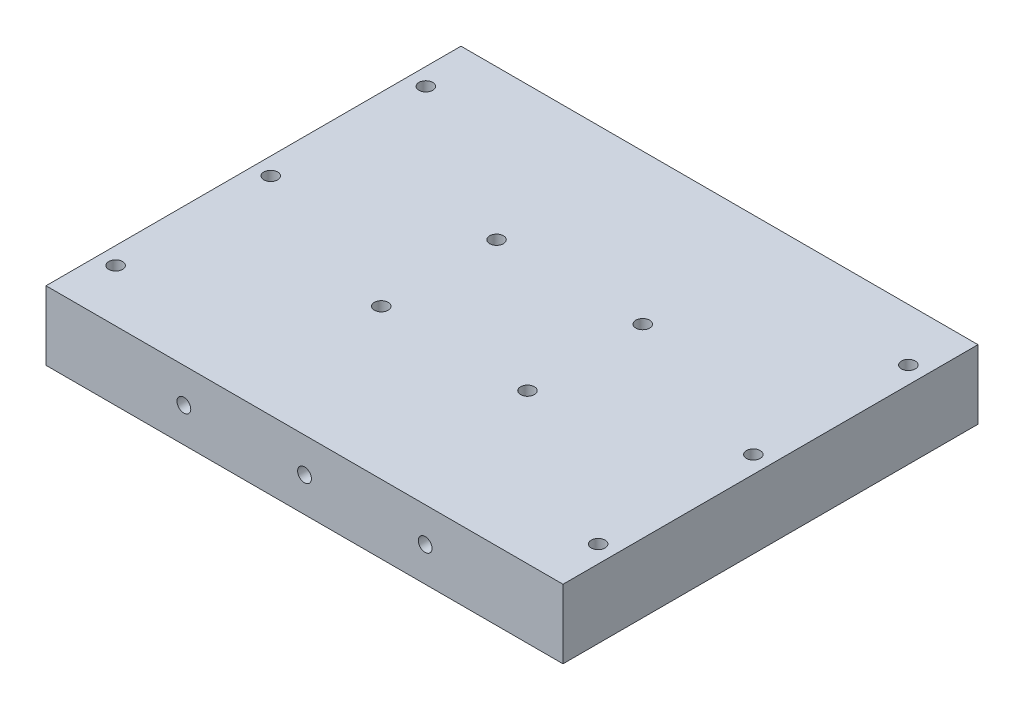
ISO-10303-21;
HEADER;
FILE_DESCRIPTION(('STEP AP214'),'2;1');
FILE_NAME('part.step','',(''),(''),'','','');
FILE_SCHEMA(('AUTOMOTIVE_DESIGN { 1 0 10303 214 1 1 1 1 }'));
ENDSEC;
DATA;
#1=APPLICATION_CONTEXT('core data for automotive mechanical design processes');
#2=APPLICATION_PROTOCOL_DEFINITION('international standard','automotive_design',2000,#1);
#3=PRODUCT_CONTEXT('',#1,'mechanical');
#4=PRODUCT('Part','Part','',(#3));
#5=PRODUCT_RELATED_PRODUCT_CATEGORY('part','',(#4));
#6=PRODUCT_DEFINITION_FORMATION('','',#4);
#7=PRODUCT_DEFINITION_CONTEXT('part definition',#1,'design');
#8=PRODUCT_DEFINITION('design','',#6,#7);
#9=PRODUCT_DEFINITION_SHAPE('','',#8);
#10=(LENGTH_UNIT() NAMED_UNIT(*) SI_UNIT(.MILLI.,.METRE.));
#11=(NAMED_UNIT(*) PLANE_ANGLE_UNIT() SI_UNIT($,.RADIAN.));
#12=(NAMED_UNIT(*) SI_UNIT($,.STERADIAN.) SOLID_ANGLE_UNIT());
#13=UNCERTAINTY_MEASURE_WITH_UNIT(LENGTH_MEASURE(1.E-05),#10,'distance_accuracy_value','');
#14=(GEOMETRIC_REPRESENTATION_CONTEXT(3) GLOBAL_UNCERTAINTY_ASSIGNED_CONTEXT((#13)) GLOBAL_UNIT_ASSIGNED_CONTEXT((#10,
#11,#12)) REPRESENTATION_CONTEXT('',''));
#15=CARTESIAN_POINT('',(0.,0.,0.));
#16=DIRECTION('',(0.,0.,1.));
#17=DIRECTION('',(1.,0.,0.));
#18=AXIS2_PLACEMENT_3D('',#15,#16,#17);
#19=CARTESIAN_POINT('',(0.,20.,0.));
#20=DIRECTION('',(1.,0.,0.));
#21=DIRECTION('',(0.,0.,-1.));
#22=AXIS2_PLACEMENT_3D('',#19,#20,#21);
#23=PLANE('',#22);
#24=DIRECTION('',(0.,0.,1.));
#25=VECTOR('',#24,1.);
#26=CARTESIAN_POINT('',(0.,0.,0.));
#27=LINE('',#26,#25);
#28=CARTESIAN_POINT('',(0.,0.,-120.4));
#29=VERTEX_POINT('',#28);
#30=CARTESIAN_POINT('',(0.,0.,0.));
#31=VERTEX_POINT('',#30);
#32=EDGE_CURVE('E96',#29,#31,#27,.T.);
#33=ORIENTED_EDGE('',*,*,#32,.T.);
#34=DIRECTION('',(0.,-1.,0.));
#35=VECTOR('',#34,1.);
#36=CARTESIAN_POINT('',(0.,20.,0.));
#37=LINE('',#36,#35);
#38=CARTESIAN_POINT('',(0.,20.,0.));
#39=VERTEX_POINT('',#38);
#40=EDGE_CURVE('E11',#39,#31,#37,.T.);
#41=ORIENTED_EDGE('',*,*,#40,.F.);
#42=DIRECTION('',(0.,0.,1.));
#43=VECTOR('',#42,1.);
#44=CARTESIAN_POINT('',(0.,20.,0.));
#45=LINE('',#44,#43);
#46=CARTESIAN_POINT('',(0.,20.,-120.4));
#47=VERTEX_POINT('',#46);
#48=EDGE_CURVE('E84',#47,#39,#45,.T.);
#49=ORIENTED_EDGE('',*,*,#48,.F.);
#50=DIRECTION('',(0.,-1.,0.));
#51=VECTOR('',#50,1.);
#52=CARTESIAN_POINT('',(0.,20.,-120.4));
#53=LINE('',#52,#51);
#54=EDGE_CURVE('E92',#47,#29,#53,.T.);
#55=ORIENTED_EDGE('',*,*,#54,.T.);
#56=EDGE_LOOP('',(#33,#41,#49,#55));
#57=FACE_BOUND('',#56,.T.);
#58=ADVANCED_FACE('F33',(#57),#23,.F.);
#59=CARTESIAN_POINT('',(0.,20.,0.));
#60=DIRECTION('',(0.,0.,-1.));
#61=DIRECTION('',(-1.,0.,0.));
#62=AXIS2_PLACEMENT_3D('',#59,#60,#61);
#63=PLANE('',#62);
#64=CARTESIAN_POINT('',(110.,10.,0.));
#65=DIRECTION('',(0.,0.,1.));
#66=DIRECTION('',(1.,0.,0.));
#67=AXIS2_PLACEMENT_3D('',#64,#65,#66);
#68=CIRCLE('',#67,2.);
#69=CARTESIAN_POINT('',(112.,10.,0.));
#70=VERTEX_POINT('',#69);
#71=EDGE_CURVE('E134',#70,#70,#68,.T.);
#72=ORIENTED_EDGE('',*,*,#71,.F.);
#73=EDGE_LOOP('',(#72));
#74=FACE_BOUND('',#73,.T.);
#75=CARTESIAN_POINT('',(40.,10.,0.));
#76=DIRECTION('',(0.,0.,1.));
#77=DIRECTION('',(1.,0.,0.));
#78=AXIS2_PLACEMENT_3D('',#75,#76,#77);
#79=CIRCLE('',#78,2.);
#80=CARTESIAN_POINT('',(42.,10.,0.));
#81=VERTEX_POINT('',#80);
#82=EDGE_CURVE('E141',#81,#81,#79,.T.);
#83=ORIENTED_EDGE('',*,*,#82,.F.);
#84=EDGE_LOOP('',(#83));
#85=FACE_BOUND('',#84,.T.);
#86=CARTESIAN_POINT('',(75.,10.,0.));
#87=DIRECTION('',(0.,0.,1.));
#88=DIRECTION('',(1.,0.,0.));
#89=AXIS2_PLACEMENT_3D('',#86,#87,#88);
#90=CIRCLE('',#89,2.);
#91=CARTESIAN_POINT('',(77.,10.,0.));
#92=VERTEX_POINT('',#91);
#93=EDGE_CURVE('E128',#92,#92,#90,.T.);
#94=ORIENTED_EDGE('',*,*,#93,.F.);
#95=EDGE_LOOP('',(#94));
#96=FACE_BOUND('',#95,.T.);
#97=DIRECTION('',(1.,0.,0.));
#98=VECTOR('',#97,1.);
#99=CARTESIAN_POINT('',(0.,0.,0.));
#100=LINE('',#99,#98);
#101=CARTESIAN_POINT('',(150.,0.,0.));
#102=VERTEX_POINT('',#101);
#103=EDGE_CURVE('E88',#31,#102,#100,.T.);
#104=ORIENTED_EDGE('',*,*,#103,.T.);
#105=DIRECTION('',(0.,-1.,0.));
#106=VECTOR('',#105,1.);
#107=CARTESIAN_POINT('',(150.,20.,0.));
#108=LINE('',#107,#106);
#109=CARTESIAN_POINT('',(150.,20.,0.));
#110=VERTEX_POINT('',#109);
#111=EDGE_CURVE('E41',#110,#102,#108,.T.);
#112=ORIENTED_EDGE('',*,*,#111,.F.);
#113=DIRECTION('',(1.,0.,0.));
#114=VECTOR('',#113,1.);
#115=CARTESIAN_POINT('',(0.,20.,0.));
#116=LINE('',#115,#114);
#117=EDGE_CURVE('E79',#39,#110,#116,.T.);
#118=ORIENTED_EDGE('',*,*,#117,.F.);
#119=ORIENTED_EDGE('',*,*,#40,.T.);
#120=EDGE_LOOP('',(#104,#112,#118,#119));
#121=FACE_BOUND('',#120,.T.);
#122=ADVANCED_FACE('F87',(#74,#85,#96,#121),#63,.F.);
#123=CARTESIAN_POINT('',(150.,20.,0.));
#124=DIRECTION('',(-1.,0.,0.));
#125=DIRECTION('',(0.,0.,1.));
#126=AXIS2_PLACEMENT_3D('',#123,#124,#125);
#127=PLANE('',#126);
#128=DIRECTION('',(0.,0.,-1.));
#129=VECTOR('',#128,1.);
#130=CARTESIAN_POINT('',(150.,0.,0.));
#131=LINE('',#130,#129);
#132=CARTESIAN_POINT('',(150.,0.,-120.4));
#133=VERTEX_POINT('',#132);
#134=EDGE_CURVE('E66',#102,#133,#131,.T.);
#135=ORIENTED_EDGE('',*,*,#134,.T.);
#136=DIRECTION('',(0.,-1.,0.));
#137=VECTOR('',#136,1.);
#138=CARTESIAN_POINT('',(150.,20.,-120.4));
#139=LINE('',#138,#137);
#140=CARTESIAN_POINT('',(150.,20.,-120.4));
#141=VERTEX_POINT('',#140);
#142=EDGE_CURVE('E89',#141,#133,#139,.T.);
#143=ORIENTED_EDGE('',*,*,#142,.F.);
#144=DIRECTION('',(0.,0.,-1.));
#145=VECTOR('',#144,1.);
#146=CARTESIAN_POINT('',(150.,20.,0.));
#147=LINE('',#146,#145);
#148=EDGE_CURVE('E82',#110,#141,#147,.T.);
#149=ORIENTED_EDGE('',*,*,#148,.F.);
#150=ORIENTED_EDGE('',*,*,#111,.T.);
#151=EDGE_LOOP('',(#135,#143,#149,#150));
#152=FACE_BOUND('',#151,.T.);
#153=ADVANCED_FACE('F90',(#152),#127,.F.);
#154=CARTESIAN_POINT('',(0.,20.,-120.4));
#155=DIRECTION('',(0.,0.,1.));
#156=DIRECTION('',(1.,0.,0.));
#157=AXIS2_PLACEMENT_3D('',#154,#155,#156);
#158=PLANE('',#157);
#159=CARTESIAN_POINT('',(40.,10.,-120.4));
#160=DIRECTION('',(0.,0.,-1.));
#161=DIRECTION('',(-1.,0.,0.));
#162=AXIS2_PLACEMENT_3D('',#159,#160,#161);
#163=CIRCLE('',#162,2.);
#164=CARTESIAN_POINT('',(38.,10.,-120.4));
#165=VERTEX_POINT('',#164);
#166=EDGE_CURVE('E123',#165,#165,#163,.T.);
#167=ORIENTED_EDGE('',*,*,#166,.F.);
#168=EDGE_LOOP('',(#167));
#169=FACE_BOUND('',#168,.T.);
#170=CARTESIAN_POINT('',(75.,10.,-120.4));
#171=DIRECTION('',(0.,0.,-1.));
#172=DIRECTION('',(-1.,0.,0.));
#173=AXIS2_PLACEMENT_3D('',#170,#171,#172);
#174=CIRCLE('',#173,2.00000000000001);
#175=CARTESIAN_POINT('',(73.,10.,-120.4));
#176=VERTEX_POINT('',#175);
#177=EDGE_CURVE('E117',#176,#176,#174,.T.);
#178=ORIENTED_EDGE('',*,*,#177,.F.);
#179=EDGE_LOOP('',(#178));
#180=FACE_BOUND('',#179,.T.);
#181=CARTESIAN_POINT('',(110.,10.,-120.4));
#182=DIRECTION('',(0.,0.,-1.));
#183=DIRECTION('',(-1.,0.,0.));
#184=AXIS2_PLACEMENT_3D('',#181,#182,#183);
#185=CIRCLE('',#184,2.00000000000001);
#186=CARTESIAN_POINT('',(108.,10.,-120.4));
#187=VERTEX_POINT('',#186);
#188=EDGE_CURVE('E110',#187,#187,#185,.T.);
#189=ORIENTED_EDGE('',*,*,#188,.F.);
#190=EDGE_LOOP('',(#189));
#191=FACE_BOUND('',#190,.T.);
#192=DIRECTION('',(-1.,0.,0.));
#193=VECTOR('',#192,1.);
#194=CARTESIAN_POINT('',(0.,0.,-120.4));
#195=LINE('',#194,#193);
#196=EDGE_CURVE('E72',#133,#29,#195,.T.);
#197=ORIENTED_EDGE('',*,*,#196,.T.);
#198=ORIENTED_EDGE('',*,*,#54,.F.);
#199=DIRECTION('',(-1.,0.,0.));
#200=VECTOR('',#199,1.);
#201=CARTESIAN_POINT('',(0.,20.,-120.4));
#202=LINE('',#201,#200);
#203=EDGE_CURVE('E49',#141,#47,#202,.T.);
#204=ORIENTED_EDGE('',*,*,#203,.F.);
#205=ORIENTED_EDGE('',*,*,#142,.T.);
#206=EDGE_LOOP('',(#197,#198,#204,#205));
#207=FACE_BOUND('',#206,.T.);
#208=ADVANCED_FACE('F104',(#169,#180,#191,#207),#158,.F.);
#209=CARTESIAN_POINT('',(0.,20.,0.));
#210=DIRECTION('',(0.,-1.,0.));
#211=DIRECTION('',(0.,0.,-1.));
#212=AXIS2_PLACEMENT_3D('',#209,#210,#211);
#213=PLANE('',#212);
#214=CARTESIAN_POINT('',(5.,20.,-105.2));
#215=DIRECTION('',(0.,1.,0.));
#216=DIRECTION('',(0.,0.,1.));
#217=AXIS2_PLACEMENT_3D('',#214,#215,#216);
#218=CIRCLE('',#217,2.);
#219=CARTESIAN_POINT('',(5.,20.,-103.2));
#220=VERTEX_POINT('',#219);
#221=EDGE_CURVE('E176',#220,#220,#218,.T.);
#222=ORIENTED_EDGE('',*,*,#221,.F.);
#223=EDGE_LOOP('',(#222));
#224=FACE_BOUND('',#223,.T.);
#225=CARTESIAN_POINT('',(5.,20.,-60.2));
#226=DIRECTION('',(0.,1.,0.));
#227=DIRECTION('',(0.,0.,1.));
#228=AXIS2_PLACEMENT_3D('',#225,#226,#227);
#229=CIRCLE('',#228,2.);
#230=CARTESIAN_POINT('',(5.,20.,-58.2));
#231=VERTEX_POINT('',#230);
#232=EDGE_CURVE('E182',#231,#231,#229,.T.);
#233=ORIENTED_EDGE('',*,*,#232,.F.);
#234=EDGE_LOOP('',(#233));
#235=FACE_BOUND('',#234,.T.);
#236=CARTESIAN_POINT('',(5.,20.,-15.2));
#237=DIRECTION('',(0.,1.,0.));
#238=DIRECTION('',(0.,0.,1.));
#239=AXIS2_PLACEMENT_3D('',#236,#237,#238);
#240=CIRCLE('',#239,2.);
#241=CARTESIAN_POINT('',(5.,20.,-13.2));
#242=VERTEX_POINT('',#241);
#243=EDGE_CURVE('E188',#242,#242,#240,.T.);
#244=ORIENTED_EDGE('',*,*,#243,.F.);
#245=EDGE_LOOP('',(#244));
#246=FACE_BOUND('',#245,.T.);
#247=CARTESIAN_POINT('',(145.,20.,-15.2));
#248=DIRECTION('',(0.,1.,0.));
#249=DIRECTION('',(0.,0.,1.));
#250=AXIS2_PLACEMENT_3D('',#247,#248,#249);
#251=CIRCLE('',#250,2.00000000000002);
#252=CARTESIAN_POINT('',(145.,20.,-13.2));
#253=VERTEX_POINT('',#252);
#254=EDGE_CURVE('E194',#253,#253,#251,.T.);
#255=ORIENTED_EDGE('',*,*,#254,.F.);
#256=EDGE_LOOP('',(#255));
#257=FACE_BOUND('',#256,.T.);
#258=CARTESIAN_POINT('',(145.,20.,-60.2));
#259=DIRECTION('',(0.,1.,0.));
#260=DIRECTION('',(0.,0.,1.));
#261=AXIS2_PLACEMENT_3D('',#258,#259,#260);
#262=CIRCLE('',#261,1.99999999999999);
#263=CARTESIAN_POINT('',(145.,20.,-58.2));
#264=VERTEX_POINT('',#263);
#265=EDGE_CURVE('E200',#264,#264,#262,.T.);
#266=ORIENTED_EDGE('',*,*,#265,.F.);
#267=EDGE_LOOP('',(#266));
#268=FACE_BOUND('',#267,.T.);
#269=CARTESIAN_POINT('',(145.,20.,-105.2));
#270=DIRECTION('',(0.,1.,0.));
#271=DIRECTION('',(0.,0.,1.));
#272=AXIS2_PLACEMENT_3D('',#269,#270,#271);
#273=CIRCLE('',#272,2.);
#274=CARTESIAN_POINT('',(145.,20.,-103.2));
#275=VERTEX_POINT('',#274);
#276=EDGE_CURVE('E170',#275,#275,#273,.T.);
#277=ORIENTED_EDGE('',*,*,#276,.F.);
#278=EDGE_LOOP('',(#277));
#279=FACE_BOUND('',#278,.T.);
#280=CARTESIAN_POINT('',(96.21,20.,-76.92));
#281=DIRECTION('',(0.,1.,0.));
#282=DIRECTION('',(0.,0.,1.));
#283=AXIS2_PLACEMENT_3D('',#280,#281,#282);
#284=CIRCLE('',#283,2.00000000000001);
#285=CARTESIAN_POINT('',(96.21,20.,-74.92));
#286=VERTEX_POINT('',#285);
#287=EDGE_CURVE('E159',#286,#286,#284,.T.);
#288=ORIENTED_EDGE('',*,*,#287,.F.);
#289=EDGE_LOOP('',(#288));
#290=FACE_BOUND('',#289,.T.);
#291=CARTESIAN_POINT('',(53.79,20.,-43.48));
#292=DIRECTION('',(0.,1.,0.));
#293=DIRECTION('',(0.,0.,1.));
#294=AXIS2_PLACEMENT_3D('',#291,#292,#293);
#295=CIRCLE('',#294,2.);
#296=CARTESIAN_POINT('',(53.79,20.,-41.48));
#297=VERTEX_POINT('',#296);
#298=EDGE_CURVE('E152',#297,#297,#295,.T.);
#299=ORIENTED_EDGE('',*,*,#298,.F.);
#300=EDGE_LOOP('',(#299));
#301=FACE_BOUND('',#300,.T.);
#302=CARTESIAN_POINT('',(96.21,20.,-43.48));
#303=DIRECTION('',(0.,1.,0.));
#304=DIRECTION('',(0.,0.,1.));
#305=AXIS2_PLACEMENT_3D('',#302,#303,#304);
#306=CIRCLE('',#305,2.);
#307=CARTESIAN_POINT('',(96.21,20.,-41.48));
#308=VERTEX_POINT('',#307);
#309=EDGE_CURVE('E164',#308,#308,#306,.T.);
#310=ORIENTED_EDGE('',*,*,#309,.F.);
#311=EDGE_LOOP('',(#310));
#312=FACE_BOUND('',#311,.T.);
#313=CARTESIAN_POINT('',(53.79,20.,-76.92));
#314=DIRECTION('',(0.,1.,0.));
#315=DIRECTION('',(0.,0.,1.));
#316=AXIS2_PLACEMENT_3D('',#313,#314,#315);
#317=CIRCLE('',#316,2.);
#318=CARTESIAN_POINT('',(53.79,20.,-74.92));
#319=VERTEX_POINT('',#318);
#320=EDGE_CURVE('E146',#319,#319,#317,.T.);
#321=ORIENTED_EDGE('',*,*,#320,.F.);
#322=EDGE_LOOP('',(#321));
#323=FACE_BOUND('',#322,.T.);
#324=ORIENTED_EDGE('',*,*,#48,.T.);
#325=ORIENTED_EDGE('',*,*,#117,.T.);
#326=ORIENTED_EDGE('',*,*,#148,.T.);
#327=ORIENTED_EDGE('',*,*,#203,.T.);
#328=EDGE_LOOP('',(#324,#325,#326,#327));
#329=FACE_BOUND('',#328,.T.);
#330=ADVANCED_FACE('F80',(#224,#235,#246,#257,#268,#279,#290,#301,#312,#323,#329),#213,.F.);
#331=CARTESIAN_POINT('',(0.,0.,0.));
#332=DIRECTION('',(0.,-1.,0.));
#333=DIRECTION('',(0.,0.,-1.));
#334=AXIS2_PLACEMENT_3D('',#331,#332,#333);
#335=PLANE('',#334);
#336=CARTESIAN_POINT('',(5.,0.,-105.2));
#337=DIRECTION('',(0.,1.,0.));
#338=DIRECTION('',(0.,0.,1.));
#339=AXIS2_PLACEMENT_3D('',#336,#337,#338);
#340=CIRCLE('',#339,2.);
#341=CARTESIAN_POINT('',(5.,0.,-103.2));
#342=VERTEX_POINT('',#341);
#343=EDGE_CURVE('E179',#342,#342,#340,.T.);
#344=ORIENTED_EDGE('',*,*,#343,.T.);
#345=EDGE_LOOP('',(#344));
#346=FACE_BOUND('',#345,.T.);
#347=CARTESIAN_POINT('',(5.,0.,-60.2));
#348=DIRECTION('',(0.,1.,0.));
#349=DIRECTION('',(0.,0.,1.));
#350=AXIS2_PLACEMENT_3D('',#347,#348,#349);
#351=CIRCLE('',#350,2.);
#352=CARTESIAN_POINT('',(5.,0.,-58.2));
#353=VERTEX_POINT('',#352);
#354=EDGE_CURVE('E185',#353,#353,#351,.T.);
#355=ORIENTED_EDGE('',*,*,#354,.T.);
#356=EDGE_LOOP('',(#355));
#357=FACE_BOUND('',#356,.T.);
#358=CARTESIAN_POINT('',(5.,0.,-15.2));
#359=DIRECTION('',(0.,1.,0.));
#360=DIRECTION('',(0.,0.,1.));
#361=AXIS2_PLACEMENT_3D('',#358,#359,#360);
#362=CIRCLE('',#361,2.);
#363=CARTESIAN_POINT('',(5.,0.,-13.2));
#364=VERTEX_POINT('',#363);
#365=EDGE_CURVE('E191',#364,#364,#362,.T.);
#366=ORIENTED_EDGE('',*,*,#365,.T.);
#367=EDGE_LOOP('',(#366));
#368=FACE_BOUND('',#367,.T.);
#369=CARTESIAN_POINT('',(145.,0.,-15.2));
#370=DIRECTION('',(0.,1.,0.));
#371=DIRECTION('',(0.,0.,1.));
#372=AXIS2_PLACEMENT_3D('',#369,#370,#371);
#373=CIRCLE('',#372,2.00000000000002);
#374=CARTESIAN_POINT('',(145.,0.,-13.2));
#375=VERTEX_POINT('',#374);
#376=EDGE_CURVE('E197',#375,#375,#373,.T.);
#377=ORIENTED_EDGE('',*,*,#376,.T.);
#378=EDGE_LOOP('',(#377));
#379=FACE_BOUND('',#378,.T.);
#380=CARTESIAN_POINT('',(145.,0.,-60.2));
#381=DIRECTION('',(0.,1.,0.));
#382=DIRECTION('',(0.,0.,1.));
#383=AXIS2_PLACEMENT_3D('',#380,#381,#382);
#384=CIRCLE('',#383,1.99999999999999);
#385=CARTESIAN_POINT('',(145.,0.,-58.2));
#386=VERTEX_POINT('',#385);
#387=EDGE_CURVE('E173',#386,#386,#384,.T.);
#388=ORIENTED_EDGE('',*,*,#387,.T.);
#389=EDGE_LOOP('',(#388));
#390=FACE_BOUND('',#389,.T.);
#391=CARTESIAN_POINT('',(145.,0.,-105.2));
#392=DIRECTION('',(0.,1.,0.));
#393=DIRECTION('',(0.,0.,1.));
#394=AXIS2_PLACEMENT_3D('',#391,#392,#393);
#395=CIRCLE('',#394,2.);
#396=CARTESIAN_POINT('',(145.,0.,-103.2));
#397=VERTEX_POINT('',#396);
#398=EDGE_CURVE('E167',#397,#397,#395,.T.);
#399=ORIENTED_EDGE('',*,*,#398,.T.);
#400=EDGE_LOOP('',(#399));
#401=FACE_BOUND('',#400,.T.);
#402=ORIENTED_EDGE('',*,*,#32,.F.);
#403=ORIENTED_EDGE('',*,*,#196,.F.);
#404=ORIENTED_EDGE('',*,*,#134,.F.);
#405=ORIENTED_EDGE('',*,*,#103,.F.);
#406=EDGE_LOOP('',(#402,#403,#404,#405));
#407=FACE_BOUND('',#406,.T.);
#408=ADVANCED_FACE('F107',(#346,#357,#368,#379,#390,#401,#407),#335,.T.);
#409=CARTESIAN_POINT('',(110.,10.,-110.4));
#410=DIRECTION('',(0.,0.,-1.));
#411=DIRECTION('',(-1.,0.,0.));
#412=AXIS2_PLACEMENT_3D('',#409,#410,#411);
#413=CYLINDRICAL_SURFACE('',#412,2.00000000000001);
#414=CARTESIAN_POINT('',(110.,10.,-110.4));
#415=DIRECTION('',(0.,0.,-1.));
#416=DIRECTION('',(-1.,0.,0.));
#417=AXIS2_PLACEMENT_3D('',#414,#415,#416);
#418=CIRCLE('',#417,2.00000000000001);
#419=CARTESIAN_POINT('',(108.,10.,-110.4));
#420=VERTEX_POINT('',#419);
#421=EDGE_CURVE('E113',#420,#420,#418,.T.);
#422=ORIENTED_EDGE('',*,*,#421,.F.);
#423=EDGE_LOOP('',(#422));
#424=FACE_BOUND('',#423,.T.);
#425=ORIENTED_EDGE('',*,*,#188,.T.);
#426=EDGE_LOOP('',(#425));
#427=FACE_BOUND('',#426,.T.);
#428=ADVANCED_FACE('F264',(#424,#427),#413,.F.);
#429=CARTESIAN_POINT('',(110.,10.,-110.4));
#430=DIRECTION('',(0.,0.,-1.));
#431=DIRECTION('',(-1.,0.,0.));
#432=AXIS2_PLACEMENT_3D('',#429,#430,#431);
#433=PLANE('',#432);
#434=ORIENTED_EDGE('',*,*,#421,.T.);
#435=EDGE_LOOP('',(#434));
#436=FACE_BOUND('',#435,.T.);
#437=ADVANCED_FACE('F269',(#436),#433,.T.);
#438=CARTESIAN_POINT('',(75.,10.,-110.4));
#439=DIRECTION('',(0.,0.,-1.));
#440=DIRECTION('',(-1.,0.,0.));
#441=AXIS2_PLACEMENT_3D('',#438,#439,#440);
#442=CYLINDRICAL_SURFACE('',#441,2.00000000000001);
#443=CARTESIAN_POINT('',(75.,10.,-110.4));
#444=DIRECTION('',(0.,0.,-1.));
#445=DIRECTION('',(-1.,0.,0.));
#446=AXIS2_PLACEMENT_3D('',#443,#444,#445);
#447=CIRCLE('',#446,2.00000000000001);
#448=CARTESIAN_POINT('',(73.,10.,-110.4));
#449=VERTEX_POINT('',#448);
#450=EDGE_CURVE('E120',#449,#449,#447,.T.);
#451=ORIENTED_EDGE('',*,*,#450,.F.);
#452=EDGE_LOOP('',(#451));
#453=FACE_BOUND('',#452,.T.);
#454=ORIENTED_EDGE('',*,*,#177,.T.);
#455=EDGE_LOOP('',(#454));
#456=FACE_BOUND('',#455,.T.);
#457=ADVANCED_FACE('F273',(#453,#456),#442,.F.);
#458=CARTESIAN_POINT('',(75.,10.,-110.4));
#459=DIRECTION('',(0.,0.,-1.));
#460=DIRECTION('',(-1.,0.,0.));
#461=AXIS2_PLACEMENT_3D('',#458,#459,#460);
#462=PLANE('',#461);
#463=ORIENTED_EDGE('',*,*,#450,.T.);
#464=EDGE_LOOP('',(#463));
#465=FACE_BOUND('',#464,.T.);
#466=ADVANCED_FACE('F277',(#465),#462,.T.);
#467=CARTESIAN_POINT('',(40.,10.,-110.4));
#468=DIRECTION('',(0.,0.,-1.));
#469=DIRECTION('',(-1.,0.,0.));
#470=AXIS2_PLACEMENT_3D('',#467,#468,#469);
#471=CYLINDRICAL_SURFACE('',#470,2.);
#472=CARTESIAN_POINT('',(40.,10.,-110.4));
#473=DIRECTION('',(0.,0.,-1.));
#474=DIRECTION('',(-1.,0.,0.));
#475=AXIS2_PLACEMENT_3D('',#472,#473,#474);
#476=CIRCLE('',#475,2.);
#477=CARTESIAN_POINT('',(38.,10.,-110.4));
#478=VERTEX_POINT('',#477);
#479=EDGE_CURVE('E99',#478,#478,#476,.T.);
#480=ORIENTED_EDGE('',*,*,#479,.F.);
#481=EDGE_LOOP('',(#480));
#482=FACE_BOUND('',#481,.T.);
#483=ORIENTED_EDGE('',*,*,#166,.T.);
#484=EDGE_LOOP('',(#483));
#485=FACE_BOUND('',#484,.T.);
#486=ADVANCED_FACE('F281',(#482,#485),#471,.F.);
#487=CARTESIAN_POINT('',(40.,10.,-110.4));
#488=DIRECTION('',(0.,0.,-1.));
#489=DIRECTION('',(-1.,0.,0.));
#490=AXIS2_PLACEMENT_3D('',#487,#488,#489);
#491=PLANE('',#490);
#492=ORIENTED_EDGE('',*,*,#479,.T.);
#493=EDGE_LOOP('',(#492));
#494=FACE_BOUND('',#493,.T.);
#495=ADVANCED_FACE('F285',(#494),#491,.T.);
#496=CARTESIAN_POINT('',(75.,10.,-10.));
#497=DIRECTION('',(0.,0.,1.));
#498=DIRECTION('',(1.,0.,0.));
#499=AXIS2_PLACEMENT_3D('',#496,#497,#498);
#500=CYLINDRICAL_SURFACE('',#499,2.);
#501=CARTESIAN_POINT('',(75.,10.,-10.));
#502=DIRECTION('',(0.,0.,1.));
#503=DIRECTION('',(1.,0.,0.));
#504=AXIS2_PLACEMENT_3D('',#501,#502,#503);
#505=CIRCLE('',#504,2.);
#506=CARTESIAN_POINT('',(77.,10.,-10.));
#507=VERTEX_POINT('',#506);
#508=EDGE_CURVE('E114',#507,#507,#505,.T.);
#509=ORIENTED_EDGE('',*,*,#508,.F.);
#510=EDGE_LOOP('',(#509));
#511=FACE_BOUND('',#510,.T.);
#512=ORIENTED_EDGE('',*,*,#93,.T.);
#513=EDGE_LOOP('',(#512));
#514=FACE_BOUND('',#513,.T.);
#515=ADVANCED_FACE('F289',(#511,#514),#500,.F.);
#516=CARTESIAN_POINT('',(75.,10.,-10.));
#517=DIRECTION('',(0.,0.,1.));
#518=DIRECTION('',(1.,0.,0.));
#519=AXIS2_PLACEMENT_3D('',#516,#517,#518);
#520=PLANE('',#519);
#521=ORIENTED_EDGE('',*,*,#508,.T.);
#522=EDGE_LOOP('',(#521));
#523=FACE_BOUND('',#522,.T.);
#524=ADVANCED_FACE('F293',(#523),#520,.T.);
#525=CARTESIAN_POINT('',(40.,10.,-10.));
#526=DIRECTION('',(0.,0.,1.));
#527=DIRECTION('',(1.,0.,0.));
#528=AXIS2_PLACEMENT_3D('',#525,#526,#527);
#529=CYLINDRICAL_SURFACE('',#528,2.);
#530=CARTESIAN_POINT('',(40.,10.,-10.));
#531=DIRECTION('',(0.,0.,1.));
#532=DIRECTION('',(1.,0.,0.));
#533=AXIS2_PLACEMENT_3D('',#530,#531,#532);
#534=CIRCLE('',#533,2.);
#535=CARTESIAN_POINT('',(42.,10.,-10.));
#536=VERTEX_POINT('',#535);
#537=EDGE_CURVE('E131',#536,#536,#534,.T.);
#538=ORIENTED_EDGE('',*,*,#537,.F.);
#539=EDGE_LOOP('',(#538));
#540=FACE_BOUND('',#539,.T.);
#541=ORIENTED_EDGE('',*,*,#82,.T.);
#542=EDGE_LOOP('',(#541));
#543=FACE_BOUND('',#542,.T.);
#544=ADVANCED_FACE('F297',(#540,#543),#529,.F.);
#545=CARTESIAN_POINT('',(40.,10.,-10.));
#546=DIRECTION('',(0.,0.,1.));
#547=DIRECTION('',(1.,0.,0.));
#548=AXIS2_PLACEMENT_3D('',#545,#546,#547);
#549=PLANE('',#548);
#550=ORIENTED_EDGE('',*,*,#537,.T.);
#551=EDGE_LOOP('',(#550));
#552=FACE_BOUND('',#551,.T.);
#553=ADVANCED_FACE('F300',(#552),#549,.T.);
#554=CARTESIAN_POINT('',(110.,10.,-10.));
#555=DIRECTION('',(0.,0.,1.));
#556=DIRECTION('',(1.,0.,0.));
#557=AXIS2_PLACEMENT_3D('',#554,#555,#556);
#558=CYLINDRICAL_SURFACE('',#557,2.);
#559=CARTESIAN_POINT('',(110.,10.,-10.));
#560=DIRECTION('',(0.,0.,1.));
#561=DIRECTION('',(1.,0.,0.));
#562=AXIS2_PLACEMENT_3D('',#559,#560,#561);
#563=CIRCLE('',#562,2.);
#564=CARTESIAN_POINT('',(112.,10.,-10.));
#565=VERTEX_POINT('',#564);
#566=EDGE_CURVE('E137',#565,#565,#563,.T.);
#567=ORIENTED_EDGE('',*,*,#566,.F.);
#568=EDGE_LOOP('',(#567));
#569=FACE_BOUND('',#568,.T.);
#570=ORIENTED_EDGE('',*,*,#71,.T.);
#571=EDGE_LOOP('',(#570));
#572=FACE_BOUND('',#571,.T.);
#573=ADVANCED_FACE('F243',(#569,#572),#558,.F.);
#574=CARTESIAN_POINT('',(110.,10.,-10.));
#575=DIRECTION('',(0.,0.,1.));
#576=DIRECTION('',(1.,0.,0.));
#577=AXIS2_PLACEMENT_3D('',#574,#575,#576);
#578=PLANE('',#577);
#579=ORIENTED_EDGE('',*,*,#566,.T.);
#580=EDGE_LOOP('',(#579));
#581=FACE_BOUND('',#580,.T.);
#582=ADVANCED_FACE('F233',(#581),#578,.T.);
#583=CARTESIAN_POINT('',(53.79,10.,-76.92));
#584=DIRECTION('',(0.,1.,0.));
#585=DIRECTION('',(0.,0.,1.));
#586=AXIS2_PLACEMENT_3D('',#583,#584,#585);
#587=CYLINDRICAL_SURFACE('',#586,2.);
#588=CARTESIAN_POINT('',(53.79,10.,-76.92));
#589=DIRECTION('',(0.,1.,0.));
#590=DIRECTION('',(0.,0.,1.));
#591=AXIS2_PLACEMENT_3D('',#588,#589,#590);
#592=CIRCLE('',#591,2.);
#593=CARTESIAN_POINT('',(53.79,10.,-74.92));
#594=VERTEX_POINT('',#593);
#595=EDGE_CURVE('E138',#594,#594,#592,.T.);
#596=ORIENTED_EDGE('',*,*,#595,.F.);
#597=EDGE_LOOP('',(#596));
#598=FACE_BOUND('',#597,.T.);
#599=ORIENTED_EDGE('',*,*,#320,.T.);
#600=EDGE_LOOP('',(#599));
#601=FACE_BOUND('',#600,.T.);
#602=ADVANCED_FACE('F230',(#598,#601),#587,.F.);
#603=CARTESIAN_POINT('',(53.79,10.,-76.92));
#604=DIRECTION('',(0.,1.,0.));
#605=DIRECTION('',(0.,0.,1.));
#606=AXIS2_PLACEMENT_3D('',#603,#604,#605);
#607=PLANE('',#606);
#608=ORIENTED_EDGE('',*,*,#595,.T.);
#609=EDGE_LOOP('',(#608));
#610=FACE_BOUND('',#609,.T.);
#611=ADVANCED_FACE('F232',(#610),#607,.T.);
#612=CARTESIAN_POINT('',(96.21,10.,-43.48));
#613=DIRECTION('',(0.,1.,0.));
#614=DIRECTION('',(0.,0.,1.));
#615=AXIS2_PLACEMENT_3D('',#612,#613,#614);
#616=CYLINDRICAL_SURFACE('',#615,2.);
#617=CARTESIAN_POINT('',(96.21,10.,-43.48));
#618=DIRECTION('',(0.,1.,0.));
#619=DIRECTION('',(0.,0.,1.));
#620=AXIS2_PLACEMENT_3D('',#617,#618,#619);
#621=CIRCLE('',#620,2.);
#622=CARTESIAN_POINT('',(96.21,10.,-41.48));
#623=VERTEX_POINT('',#622);
#624=EDGE_CURVE('E156',#623,#623,#621,.T.);
#625=ORIENTED_EDGE('',*,*,#624,.F.);
#626=EDGE_LOOP('',(#625));
#627=FACE_BOUND('',#626,.T.);
#628=ORIENTED_EDGE('',*,*,#309,.T.);
#629=EDGE_LOOP('',(#628));
#630=FACE_BOUND('',#629,.T.);
#631=ADVANCED_FACE('F240',(#627,#630),#616,.F.);
#632=CARTESIAN_POINT('',(96.21,10.,-43.48));
#633=DIRECTION('',(0.,1.,0.));
#634=DIRECTION('',(0.,0.,1.));
#635=AXIS2_PLACEMENT_3D('',#632,#633,#634);
#636=PLANE('',#635);
#637=ORIENTED_EDGE('',*,*,#624,.T.);
#638=EDGE_LOOP('',(#637));
#639=FACE_BOUND('',#638,.T.);
#640=ADVANCED_FACE('F344',(#639),#636,.T.);
#641=CARTESIAN_POINT('',(53.79,10.,-43.48));
#642=DIRECTION('',(0.,1.,0.));
#643=DIRECTION('',(0.,0.,1.));
#644=AXIS2_PLACEMENT_3D('',#641,#642,#643);
#645=CYLINDRICAL_SURFACE('',#644,2.);
#646=CARTESIAN_POINT('',(53.79,10.,-43.48));
#647=DIRECTION('',(0.,1.,0.));
#648=DIRECTION('',(0.,0.,1.));
#649=AXIS2_PLACEMENT_3D('',#646,#647,#648);
#650=CIRCLE('',#649,2.);
#651=CARTESIAN_POINT('',(53.79,10.,-41.48));
#652=VERTEX_POINT('',#651);
#653=EDGE_CURVE('E155',#652,#652,#650,.T.);
#654=ORIENTED_EDGE('',*,*,#653,.F.);
#655=EDGE_LOOP('',(#654));
#656=FACE_BOUND('',#655,.T.);
#657=ORIENTED_EDGE('',*,*,#298,.T.);
#658=EDGE_LOOP('',(#657));
#659=FACE_BOUND('',#658,.T.);
#660=ADVANCED_FACE('F354',(#656,#659),#645,.F.);
#661=CARTESIAN_POINT('',(53.79,10.,-43.48));
#662=DIRECTION('',(0.,1.,0.));
#663=DIRECTION('',(0.,0.,1.));
#664=AXIS2_PLACEMENT_3D('',#661,#662,#663);
#665=PLANE('',#664);
#666=ORIENTED_EDGE('',*,*,#653,.T.);
#667=EDGE_LOOP('',(#666));
#668=FACE_BOUND('',#667,.T.);
#669=ADVANCED_FACE('F364',(#668),#665,.T.);
#670=CARTESIAN_POINT('',(96.21,10.,-76.92));
#671=DIRECTION('',(0.,1.,0.));
#672=DIRECTION('',(0.,0.,1.));
#673=AXIS2_PLACEMENT_3D('',#670,#671,#672);
#674=CYLINDRICAL_SURFACE('',#673,2.00000000000001);
#675=CARTESIAN_POINT('',(96.21,10.,-76.92));
#676=DIRECTION('',(0.,1.,0.));
#677=DIRECTION('',(0.,0.,1.));
#678=AXIS2_PLACEMENT_3D('',#675,#676,#677);
#679=CIRCLE('',#678,2.00000000000001);
#680=CARTESIAN_POINT('',(96.21,10.,-74.92));
#681=VERTEX_POINT('',#680);
#682=EDGE_CURVE('E149',#681,#681,#679,.T.);
#683=ORIENTED_EDGE('',*,*,#682,.F.);
#684=EDGE_LOOP('',(#683));
#685=FACE_BOUND('',#684,.T.);
#686=ORIENTED_EDGE('',*,*,#287,.T.);
#687=EDGE_LOOP('',(#686));
#688=FACE_BOUND('',#687,.T.);
#689=ADVANCED_FACE('F374',(#685,#688),#674,.F.);
#690=CARTESIAN_POINT('',(96.21,10.,-76.92));
#691=DIRECTION('',(0.,1.,0.));
#692=DIRECTION('',(0.,0.,1.));
#693=AXIS2_PLACEMENT_3D('',#690,#691,#692);
#694=PLANE('',#693);
#695=ORIENTED_EDGE('',*,*,#682,.T.);
#696=EDGE_LOOP('',(#695));
#697=FACE_BOUND('',#696,.T.);
#698=ADVANCED_FACE('F384',(#697),#694,.T.);
#699=CARTESIAN_POINT('',(145.,0.,-105.2));
#700=DIRECTION('',(0.,1.,0.));
#701=DIRECTION('',(0.,0.,1.));
#702=AXIS2_PLACEMENT_3D('',#699,#700,#701);
#703=CYLINDRICAL_SURFACE('',#702,2.);
#704=ORIENTED_EDGE('',*,*,#398,.F.);
#705=EDGE_LOOP('',(#704));
#706=FACE_BOUND('',#705,.T.);
#707=ORIENTED_EDGE('',*,*,#276,.T.);
#708=EDGE_LOOP('',(#707));
#709=FACE_BOUND('',#708,.T.);
#710=ADVANCED_FACE('F212',(#706,#709),#703,.F.);
#711=CARTESIAN_POINT('',(145.,0.,-60.2));
#712=DIRECTION('',(0.,1.,0.));
#713=DIRECTION('',(0.,0.,1.));
#714=AXIS2_PLACEMENT_3D('',#711,#712,#713);
#715=CYLINDRICAL_SURFACE('',#714,1.99999999999999);
#716=ORIENTED_EDGE('',*,*,#387,.F.);
#717=EDGE_LOOP('',(#716));
#718=FACE_BOUND('',#717,.T.);
#719=ORIENTED_EDGE('',*,*,#265,.T.);
#720=EDGE_LOOP('',(#719));
#721=FACE_BOUND('',#720,.T.);
#722=ADVANCED_FACE('F208',(#718,#721),#715,.F.);
#723=CARTESIAN_POINT('',(145.,0.,-15.2));
#724=DIRECTION('',(0.,1.,0.));
#725=DIRECTION('',(0.,0.,1.));
#726=AXIS2_PLACEMENT_3D('',#723,#724,#725);
#727=CYLINDRICAL_SURFACE('',#726,2.00000000000002);
#728=ORIENTED_EDGE('',*,*,#376,.F.);
#729=EDGE_LOOP('',(#728));
#730=FACE_BOUND('',#729,.T.);
#731=ORIENTED_EDGE('',*,*,#254,.T.);
#732=EDGE_LOOP('',(#731));
#733=FACE_BOUND('',#732,.T.);
#734=ADVANCED_FACE('F211',(#730,#733),#727,.F.);
#735=CARTESIAN_POINT('',(5.,0.,-15.2));
#736=DIRECTION('',(0.,1.,0.));
#737=DIRECTION('',(0.,0.,1.));
#738=AXIS2_PLACEMENT_3D('',#735,#736,#737);
#739=CYLINDRICAL_SURFACE('',#738,2.);
#740=ORIENTED_EDGE('',*,*,#365,.F.);
#741=EDGE_LOOP('',(#740));
#742=FACE_BOUND('',#741,.T.);
#743=ORIENTED_EDGE('',*,*,#243,.T.);
#744=EDGE_LOOP('',(#743));
#745=FACE_BOUND('',#744,.T.);
#746=ADVANCED_FACE('F432',(#742,#745),#739,.F.);
#747=CARTESIAN_POINT('',(5.,0.,-60.2));
#748=DIRECTION('',(0.,1.,0.));
#749=DIRECTION('',(0.,0.,1.));
#750=AXIS2_PLACEMENT_3D('',#747,#748,#749);
#751=CYLINDRICAL_SURFACE('',#750,2.);
#752=ORIENTED_EDGE('',*,*,#354,.F.);
#753=EDGE_LOOP('',(#752));
#754=FACE_BOUND('',#753,.T.);
#755=ORIENTED_EDGE('',*,*,#232,.T.);
#756=EDGE_LOOP('',(#755));
#757=FACE_BOUND('',#756,.T.);
#758=ADVANCED_FACE('F442',(#754,#757),#751,.F.);
#759=CARTESIAN_POINT('',(5.,0.,-105.2));
#760=DIRECTION('',(0.,1.,0.));
#761=DIRECTION('',(0.,0.,1.));
#762=AXIS2_PLACEMENT_3D('',#759,#760,#761);
#763=CYLINDRICAL_SURFACE('',#762,2.);
#764=ORIENTED_EDGE('',*,*,#343,.F.);
#765=EDGE_LOOP('',(#764));
#766=FACE_BOUND('',#765,.T.);
#767=ORIENTED_EDGE('',*,*,#221,.T.);
#768=EDGE_LOOP('',(#767));
#769=FACE_BOUND('',#768,.T.);
#770=ADVANCED_FACE('F452',(#766,#769),#763,.F.);
#771=CLOSED_SHELL('',(#58,#122,#153,#208,#330,#408,#428,#437,#457,#466,#486,#495,#515,#524,#544,
#553,#573,#582,#602,#611,#631,#640,#660,#669,#689,#698,#710,#722,#734,#746,#758,#770));
#772=MANIFOLD_SOLID_BREP('B2',#771);
#773=ADVANCED_BREP_SHAPE_REPRESENTATION('',(#18,#772),#14);
#774=SHAPE_DEFINITION_REPRESENTATION(#9,#773);
ENDSEC;
END-ISO-10303-21;
